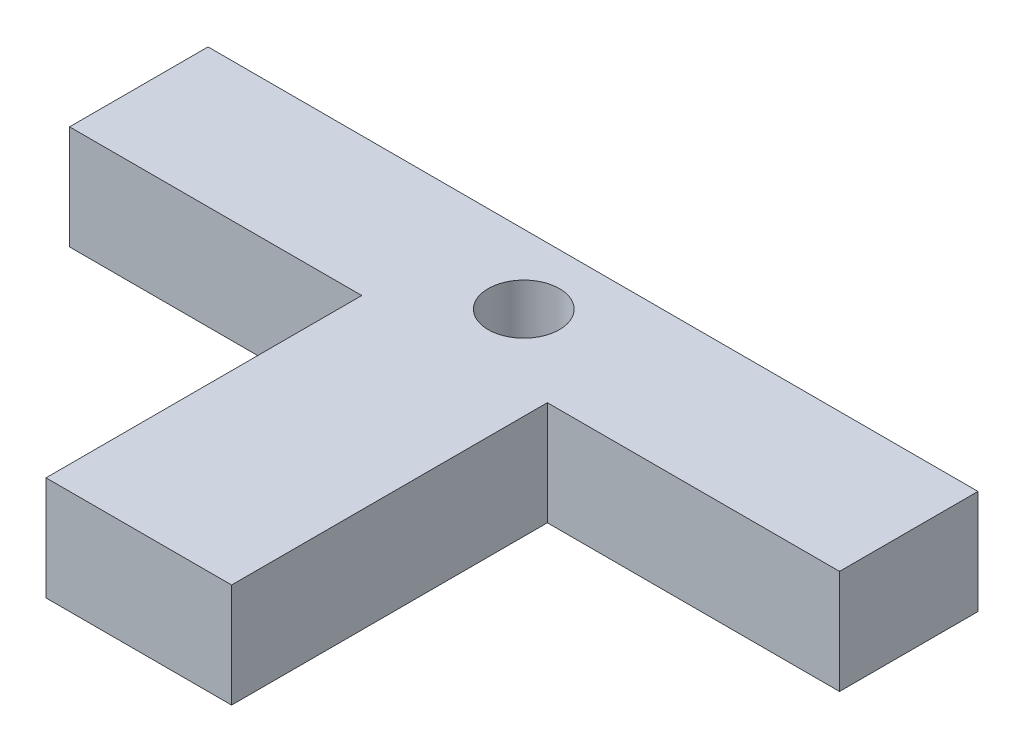
ISO-10303-21;
HEADER;
FILE_DESCRIPTION(('STEP AP214'),'2;1');
FILE_NAME('part.step','',(''),(''),'','','');
FILE_SCHEMA(('AUTOMOTIVE_DESIGN { 1 0 10303 214 1 1 1 1 }'));
ENDSEC;
DATA;
#1=APPLICATION_CONTEXT('core data for automotive mechanical design processes');
#2=APPLICATION_PROTOCOL_DEFINITION('international standard','automotive_design',2000,#1);
#3=PRODUCT_CONTEXT('',#1,'mechanical');
#4=PRODUCT('Part','Part','',(#3));
#5=PRODUCT_RELATED_PRODUCT_CATEGORY('part','',(#4));
#6=PRODUCT_DEFINITION_FORMATION('','',#4);
#7=PRODUCT_DEFINITION_CONTEXT('part definition',#1,'design');
#8=PRODUCT_DEFINITION('design','',#6,#7);
#9=PRODUCT_DEFINITION_SHAPE('','',#8);
#10=(LENGTH_UNIT() NAMED_UNIT(*) SI_UNIT(.MILLI.,.METRE.));
#11=(NAMED_UNIT(*) PLANE_ANGLE_UNIT() SI_UNIT($,.RADIAN.));
#12=(NAMED_UNIT(*) SI_UNIT($,.STERADIAN.) SOLID_ANGLE_UNIT());
#13=UNCERTAINTY_MEASURE_WITH_UNIT(LENGTH_MEASURE(1.E-05),#10,'distance_accuracy_value','');
#14=(GEOMETRIC_REPRESENTATION_CONTEXT(3) GLOBAL_UNCERTAINTY_ASSIGNED_CONTEXT((#13)) GLOBAL_UNIT_ASSIGNED_CONTEXT((#10,
#11,#12)) REPRESENTATION_CONTEXT('',''));
#15=CARTESIAN_POINT('',(0.,0.,0.));
#16=DIRECTION('',(0.,0.,1.));
#17=DIRECTION('',(1.,0.,0.));
#18=AXIS2_PLACEMENT_3D('',#15,#16,#17);
#19=CARTESIAN_POINT('',(0.,15.,9.98106032148149));
#20=DIRECTION('',(0.,0.,-1.));
#21=DIRECTION('',(-1.,0.,0.));
#22=AXIS2_PLACEMENT_3D('',#19,#20,#21);
#23=PLANE('',#22);
#24=DIRECTION('',(1.,0.,0.));
#25=VECTOR('',#24,1.);
#26=CARTESIAN_POINT('',(0.,0.,9.98106032148149));
#27=LINE('',#26,#25);
#28=CARTESIAN_POINT('',(-55.5,0.,9.98106032148149));
#29=VERTEX_POINT('',#28);
#30=CARTESIAN_POINT('',(-13.3786796564402,0.,9.98106032148149));
#31=VERTEX_POINT('',#30);
#32=EDGE_CURVE('E155',#29,#31,#27,.T.);
#33=ORIENTED_EDGE('',*,*,#32,.T.);
#34=DIRECTION('',(0.,-1.,0.));
#35=VECTOR('',#34,1.);
#36=CARTESIAN_POINT('',(-13.3786796564402,15.,9.98106032148149));
#37=LINE('',#36,#35);
#38=CARTESIAN_POINT('',(-13.3786796564402,15.,9.98106032148149));
#39=VERTEX_POINT('',#38);
#40=EDGE_CURVE('E11',#39,#31,#37,.T.);
#41=ORIENTED_EDGE('',*,*,#40,.F.);
#42=DIRECTION('',(1.,0.,0.));
#43=VECTOR('',#42,1.);
#44=CARTESIAN_POINT('',(0.,15.,9.98106032148149));
#45=LINE('',#44,#43);
#46=CARTESIAN_POINT('',(-55.5,15.,9.98106032148149));
#47=VERTEX_POINT('',#46);
#48=EDGE_CURVE('E211',#47,#39,#45,.T.);
#49=ORIENTED_EDGE('',*,*,#48,.F.);
#50=DIRECTION('',(0.,-1.,0.));
#51=VECTOR('',#50,1.);
#52=CARTESIAN_POINT('',(-55.5,15.,9.98106032148149));
#53=LINE('',#52,#51);
#54=EDGE_CURVE('E65',#47,#29,#53,.T.);
#55=ORIENTED_EDGE('',*,*,#54,.T.);
#56=EDGE_LOOP('',(#33,#41,#49,#55));
#57=FACE_BOUND('',#56,.T.);
#58=ADVANCED_FACE('F47',(#57),#23,.F.);
#59=CARTESIAN_POINT('',(-13.3786796564402,15.,0.));
#60=DIRECTION('',(1.,0.,0.));
#61=DIRECTION('',(0.,0.,-1.));
#62=AXIS2_PLACEMENT_3D('',#59,#60,#61);
#63=PLANE('',#62);
#64=DIRECTION('',(0.,0.,1.));
#65=VECTOR('',#64,1.);
#66=CARTESIAN_POINT('',(-13.3786796564402,0.,0.));
#67=LINE('',#66,#65);
#68=CARTESIAN_POINT('',(-13.3786796564401,0.,55.5));
#69=VERTEX_POINT('',#68);
#70=EDGE_CURVE('E158',#31,#69,#67,.T.);
#71=ORIENTED_EDGE('',*,*,#70,.T.);
#72=DIRECTION('',(0.,-1.,0.));
#73=VECTOR('',#72,1.);
#74=CARTESIAN_POINT('',(-13.3786796564401,15.,55.5));
#75=LINE('',#74,#73);
#76=CARTESIAN_POINT('',(-13.3786796564401,15.,55.5));
#77=VERTEX_POINT('',#76);
#78=EDGE_CURVE('E57',#77,#69,#75,.T.);
#79=ORIENTED_EDGE('',*,*,#78,.F.);
#80=DIRECTION('',(0.,0.,1.));
#81=VECTOR('',#80,1.);
#82=CARTESIAN_POINT('',(-13.3786796564402,15.,0.));
#83=LINE('',#82,#81);
#84=EDGE_CURVE('E103',#39,#77,#83,.T.);
#85=ORIENTED_EDGE('',*,*,#84,.F.);
#86=ORIENTED_EDGE('',*,*,#40,.T.);
#87=EDGE_LOOP('',(#71,#79,#85,#86));
#88=FACE_BOUND('',#87,.T.);
#89=ADVANCED_FACE('F234',(#88),#63,.F.);
#90=CARTESIAN_POINT('',(0.,15.,55.5));
#91=DIRECTION('',(0.,0.,-1.));
#92=DIRECTION('',(-1.,0.,0.));
#93=AXIS2_PLACEMENT_3D('',#90,#91,#92);
#94=PLANE('',#93);
#95=DIRECTION('',(1.,0.,0.));
#96=VECTOR('',#95,1.);
#97=CARTESIAN_POINT('',(0.,0.,55.5));
#98=LINE('',#97,#96);
#99=CARTESIAN_POINT('',(13.3786796564402,0.,55.5));
#100=VERTEX_POINT('',#99);
#101=EDGE_CURVE('E162',#69,#100,#98,.T.);
#102=ORIENTED_EDGE('',*,*,#101,.T.);
#103=DIRECTION('',(0.,-1.,0.));
#104=VECTOR('',#103,1.);
#105=CARTESIAN_POINT('',(13.3786796564402,15.,55.5));
#106=LINE('',#105,#104);
#107=CARTESIAN_POINT('',(13.3786796564402,15.,55.5));
#108=VERTEX_POINT('',#107);
#109=EDGE_CURVE('E189',#108,#100,#106,.T.);
#110=ORIENTED_EDGE('',*,*,#109,.F.);
#111=DIRECTION('',(1.,0.,0.));
#112=VECTOR('',#111,1.);
#113=CARTESIAN_POINT('',(0.,15.,55.5));
#114=LINE('',#113,#112);
#115=EDGE_CURVE('E198',#77,#108,#114,.T.);
#116=ORIENTED_EDGE('',*,*,#115,.F.);
#117=ORIENTED_EDGE('',*,*,#78,.T.);
#118=EDGE_LOOP('',(#102,#110,#116,#117));
#119=FACE_BOUND('',#118,.T.);
#120=ADVANCED_FACE('F196',(#119),#94,.F.);
#121=CARTESIAN_POINT('',(13.3786796564402,15.,0.));
#122=DIRECTION('',(1.,0.,0.));
#123=DIRECTION('',(0.,0.,-1.));
#124=AXIS2_PLACEMENT_3D('',#121,#122,#123);
#125=PLANE('',#124);
#126=DIRECTION('',(0.,0.,1.));
#127=VECTOR('',#126,1.);
#128=CARTESIAN_POINT('',(13.3786796564402,0.,0.));
#129=LINE('',#128,#127);
#130=CARTESIAN_POINT('',(13.3786796564402,0.,9.98106032148149));
#131=VERTEX_POINT('',#130);
#132=EDGE_CURVE('E166',#131,#100,#129,.T.);
#133=ORIENTED_EDGE('',*,*,#132,.F.);
#134=DIRECTION('',(0.,-1.,0.));
#135=VECTOR('',#134,1.);
#136=CARTESIAN_POINT('',(13.3786796564402,15.,9.98106032148149));
#137=LINE('',#136,#135);
#138=CARTESIAN_POINT('',(13.3786796564402,15.,9.98106032148149));
#139=VERTEX_POINT('',#138);
#140=EDGE_CURVE('E186',#139,#131,#137,.T.);
#141=ORIENTED_EDGE('',*,*,#140,.F.);
#142=DIRECTION('',(0.,0.,1.));
#143=VECTOR('',#142,1.);
#144=CARTESIAN_POINT('',(13.3786796564402,15.,0.));
#145=LINE('',#144,#143);
#146=EDGE_CURVE('E206',#139,#108,#145,.T.);
#147=ORIENTED_EDGE('',*,*,#146,.T.);
#148=ORIENTED_EDGE('',*,*,#109,.T.);
#149=EDGE_LOOP('',(#133,#141,#147,#148));
#150=FACE_BOUND('',#149,.T.);
#151=ADVANCED_FACE('F204',(#150),#125,.T.);
#152=CARTESIAN_POINT('',(55.5,0.,9.98106032148149));
#153=VERTEX_POINT('',#152);
#154=EDGE_CURVE('E159',#131,#153,#27,.T.);
#155=ORIENTED_EDGE('',*,*,#154,.T.);
#156=DIRECTION('',(0.,-1.,0.));
#157=VECTOR('',#156,1.);
#158=CARTESIAN_POINT('',(55.5,15.,9.98106032148149));
#159=LINE('',#158,#157);
#160=CARTESIAN_POINT('',(55.5,15.,9.98106032148149));
#161=VERTEX_POINT('',#160);
#162=EDGE_CURVE('E141',#161,#153,#159,.T.);
#163=ORIENTED_EDGE('',*,*,#162,.F.);
#164=EDGE_CURVE('E127',#139,#161,#45,.T.);
#165=ORIENTED_EDGE('',*,*,#164,.F.);
#166=ORIENTED_EDGE('',*,*,#140,.T.);
#167=EDGE_LOOP('',(#155,#163,#165,#166));
#168=FACE_BOUND('',#167,.T.);
#169=ADVANCED_FACE('F236',(#168),#23,.F.);
#170=CARTESIAN_POINT('',(55.5,15.,0.));
#171=DIRECTION('',(-1.,0.,0.));
#172=DIRECTION('',(0.,0.,1.));
#173=AXIS2_PLACEMENT_3D('',#170,#171,#172);
#174=PLANE('',#173);
#175=DIRECTION('',(0.,0.,-1.));
#176=VECTOR('',#175,1.);
#177=CARTESIAN_POINT('',(55.5,0.,0.));
#178=LINE('',#177,#176);
#179=CARTESIAN_POINT('',(55.5,0.,-9.98106032148148));
#180=VERTEX_POINT('',#179);
#181=EDGE_CURVE('E137',#153,#180,#178,.T.);
#182=ORIENTED_EDGE('',*,*,#181,.T.);
#183=DIRECTION('',(0.,-1.,0.));
#184=VECTOR('',#183,1.);
#185=CARTESIAN_POINT('',(55.5,15.,-9.98106032148148));
#186=LINE('',#185,#184);
#187=CARTESIAN_POINT('',(55.5,15.,-9.98106032148148));
#188=VERTEX_POINT('',#187);
#189=EDGE_CURVE('E134',#188,#180,#186,.T.);
#190=ORIENTED_EDGE('',*,*,#189,.F.);
#191=DIRECTION('',(0.,0.,-1.));
#192=VECTOR('',#191,1.);
#193=CARTESIAN_POINT('',(55.5,15.,0.));
#194=LINE('',#193,#192);
#195=EDGE_CURVE('E119',#161,#188,#194,.T.);
#196=ORIENTED_EDGE('',*,*,#195,.F.);
#197=ORIENTED_EDGE('',*,*,#162,.T.);
#198=EDGE_LOOP('',(#182,#190,#196,#197));
#199=FACE_BOUND('',#198,.T.);
#200=ADVANCED_FACE('F135',(#199),#174,.F.);
#201=CARTESIAN_POINT('',(0.,15.,-9.98106032148148));
#202=DIRECTION('',(0.,0.,-1.));
#203=DIRECTION('',(-1.,0.,0.));
#204=AXIS2_PLACEMENT_3D('',#201,#202,#203);
#205=PLANE('',#204);
#206=DIRECTION('',(1.,0.,0.));
#207=VECTOR('',#206,1.);
#208=CARTESIAN_POINT('',(0.,0.,-9.98106032148148));
#209=LINE('',#208,#207);
#210=CARTESIAN_POINT('',(-55.5,0.,-9.98106032148148));
#211=VERTEX_POINT('',#210);
#212=EDGE_CURVE('E172',#211,#180,#209,.T.);
#213=ORIENTED_EDGE('',*,*,#212,.F.);
#214=DIRECTION('',(0.,-1.,0.));
#215=VECTOR('',#214,1.);
#216=CARTESIAN_POINT('',(-55.5,15.,-9.98106032148148));
#217=LINE('',#216,#215);
#218=CARTESIAN_POINT('',(-55.5,15.,-9.98106032148148));
#219=VERTEX_POINT('',#218);
#220=EDGE_CURVE('E91',#219,#211,#217,.T.);
#221=ORIENTED_EDGE('',*,*,#220,.F.);
#222=DIRECTION('',(1.,0.,0.));
#223=VECTOR('',#222,1.);
#224=CARTESIAN_POINT('',(0.,15.,-9.98106032148148));
#225=LINE('',#224,#223);
#226=EDGE_CURVE('E124',#219,#188,#225,.T.);
#227=ORIENTED_EDGE('',*,*,#226,.T.);
#228=ORIENTED_EDGE('',*,*,#189,.T.);
#229=EDGE_LOOP('',(#213,#221,#227,#228));
#230=FACE_BOUND('',#229,.T.);
#231=ADVANCED_FACE('F143',(#230),#205,.T.);
#232=CARTESIAN_POINT('',(0.,15.,0.));
#233=DIRECTION('',(0.,-1.,0.));
#234=DIRECTION('',(0.,0.,-1.));
#235=AXIS2_PLACEMENT_3D('',#232,#233,#234);
#236=CYLINDRICAL_SURFACE('',#235,5.13500000000002);
#237=CARTESIAN_POINT('',(0.,15.,0.));
#238=DIRECTION('',(0.,1.,0.));
#239=DIRECTION('',(0.,0.,1.));
#240=AXIS2_PLACEMENT_3D('',#237,#238,#239);
#241=CIRCLE('',#240,5.13500000000002);
#242=CARTESIAN_POINT('',(0.,15.,5.13500000000002));
#243=VERTEX_POINT('',#242);
#244=EDGE_CURVE('E179',#243,#243,#241,.T.);
#245=ORIENTED_EDGE('',*,*,#244,.T.);
#246=EDGE_LOOP('',(#245));
#247=FACE_BOUND('',#246,.T.);
#248=CARTESIAN_POINT('',(0.,0.,0.));
#249=DIRECTION('',(0.,1.,0.));
#250=DIRECTION('',(0.,0.,1.));
#251=AXIS2_PLACEMENT_3D('',#248,#249,#250);
#252=CIRCLE('',#251,5.13500000000002);
#253=CARTESIAN_POINT('',(0.,0.,5.13500000000002));
#254=VERTEX_POINT('',#253);
#255=EDGE_CURVE('E151',#254,#254,#252,.T.);
#256=ORIENTED_EDGE('',*,*,#255,.F.);
#257=EDGE_LOOP('',(#256));
#258=FACE_BOUND('',#257,.T.);
#259=ADVANCED_FACE('F49',(#247,#258),#236,.F.);
#260=CARTESIAN_POINT('',(-55.5,15.,0.));
#261=DIRECTION('',(-1.,0.,0.));
#262=DIRECTION('',(0.,0.,1.));
#263=AXIS2_PLACEMENT_3D('',#260,#261,#262);
#264=PLANE('',#263);
#265=DIRECTION('',(0.,0.,-1.));
#266=VECTOR('',#265,1.);
#267=CARTESIAN_POINT('',(-55.5,0.,0.));
#268=LINE('',#267,#266);
#269=EDGE_CURVE('E175',#29,#211,#268,.T.);
#270=ORIENTED_EDGE('',*,*,#269,.F.);
#271=ORIENTED_EDGE('',*,*,#54,.F.);
#272=DIRECTION('',(0.,0.,-1.));
#273=VECTOR('',#272,1.);
#274=CARTESIAN_POINT('',(-55.5,15.,0.));
#275=LINE('',#274,#273);
#276=EDGE_CURVE('E145',#47,#219,#275,.T.);
#277=ORIENTED_EDGE('',*,*,#276,.T.);
#278=ORIENTED_EDGE('',*,*,#220,.T.);
#279=EDGE_LOOP('',(#270,#271,#277,#278));
#280=FACE_BOUND('',#279,.T.);
#281=ADVANCED_FACE('F224',(#280),#264,.T.);
#282=CARTESIAN_POINT('',(0.,15.,0.));
#283=DIRECTION('',(0.,1.,0.));
#284=DIRECTION('',(0.,0.,1.));
#285=AXIS2_PLACEMENT_3D('',#282,#283,#284);
#286=PLANE('',#285);
#287=ORIENTED_EDGE('',*,*,#244,.F.);
#288=EDGE_LOOP('',(#287));
#289=FACE_BOUND('',#288,.T.);
#290=ORIENTED_EDGE('',*,*,#48,.T.);
#291=ORIENTED_EDGE('',*,*,#84,.T.);
#292=ORIENTED_EDGE('',*,*,#115,.T.);
#293=ORIENTED_EDGE('',*,*,#146,.F.);
#294=ORIENTED_EDGE('',*,*,#164,.T.);
#295=ORIENTED_EDGE('',*,*,#195,.T.);
#296=ORIENTED_EDGE('',*,*,#226,.F.);
#297=ORIENTED_EDGE('',*,*,#276,.F.);
#298=EDGE_LOOP('',(#290,#291,#292,#293,#294,#295,#296,#297));
#299=FACE_BOUND('',#298,.T.);
#300=ADVANCED_FACE('F121',(#289,#299),#286,.T.);
#301=CARTESIAN_POINT('',(0.,0.,0.));
#302=DIRECTION('',(0.,1.,0.));
#303=DIRECTION('',(0.,0.,1.));
#304=AXIS2_PLACEMENT_3D('',#301,#302,#303);
#305=PLANE('',#304);
#306=ORIENTED_EDGE('',*,*,#255,.T.);
#307=EDGE_LOOP('',(#306));
#308=FACE_BOUND('',#307,.T.);
#309=ORIENTED_EDGE('',*,*,#32,.F.);
#310=ORIENTED_EDGE('',*,*,#269,.T.);
#311=ORIENTED_EDGE('',*,*,#212,.T.);
#312=ORIENTED_EDGE('',*,*,#181,.F.);
#313=ORIENTED_EDGE('',*,*,#154,.F.);
#314=ORIENTED_EDGE('',*,*,#132,.T.);
#315=ORIENTED_EDGE('',*,*,#101,.F.);
#316=ORIENTED_EDGE('',*,*,#70,.F.);
#317=EDGE_LOOP('',(#309,#310,#311,#312,#313,#314,#315,#316));
#318=FACE_BOUND('',#317,.T.);
#319=ADVANCED_FACE('F200',(#308,#318),#305,.F.);
#320=CLOSED_SHELL('',(#58,#89,#120,#151,#169,#200,#231,#259,#281,#300,#319));
#321=MANIFOLD_SOLID_BREP('B2',#320);
#322=ADVANCED_BREP_SHAPE_REPRESENTATION('',(#18,#321),#14);
#323=SHAPE_DEFINITION_REPRESENTATION(#9,#322);
ENDSEC;
END-ISO-10303-21;
